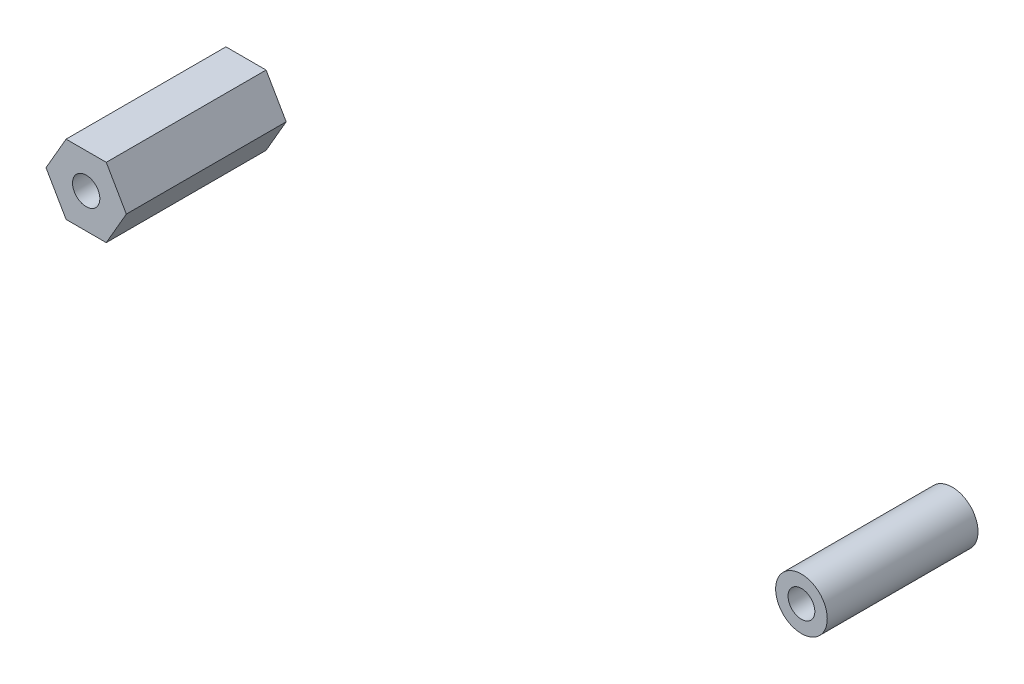
ISO-10303-21;
HEADER;
FILE_DESCRIPTION(('STEP AP214'),'2;1');
FILE_NAME('part.step','',(''),(''),'','','');
FILE_SCHEMA(('AUTOMOTIVE_DESIGN { 1 0 10303 214 1 1 1 1 }'));
ENDSEC;
DATA;
#1=APPLICATION_CONTEXT('core data for automotive mechanical design processes');
#2=APPLICATION_PROTOCOL_DEFINITION('international standard','automotive_design',2000,#1);
#3=PRODUCT_CONTEXT('',#1,'mechanical');
#4=PRODUCT('Part','Part','',(#3));
#5=PRODUCT_RELATED_PRODUCT_CATEGORY('part','',(#4));
#6=PRODUCT_DEFINITION_FORMATION('','',#4);
#7=PRODUCT_DEFINITION_CONTEXT('part definition',#1,'design');
#8=PRODUCT_DEFINITION('design','',#6,#7);
#9=PRODUCT_DEFINITION_SHAPE('','',#8);
#10=(LENGTH_UNIT() NAMED_UNIT(*) SI_UNIT(.MILLI.,.METRE.));
#11=(NAMED_UNIT(*) PLANE_ANGLE_UNIT() SI_UNIT($,.RADIAN.));
#12=(NAMED_UNIT(*) SI_UNIT($,.STERADIAN.) SOLID_ANGLE_UNIT());
#13=UNCERTAINTY_MEASURE_WITH_UNIT(LENGTH_MEASURE(1.E-05),#10,'distance_accuracy_value','');
#14=(GEOMETRIC_REPRESENTATION_CONTEXT(3) GLOBAL_UNCERTAINTY_ASSIGNED_CONTEXT((#13)) GLOBAL_UNIT_ASSIGNED_CONTEXT((#10,
#11,#12)) REPRESENTATION_CONTEXT('',''));
#15=CARTESIAN_POINT('',(0.,0.,0.));
#16=DIRECTION('',(0.,0.,1.));
#17=DIRECTION('',(1.,0.,0.));
#18=AXIS2_PLACEMENT_3D('',#15,#16,#17);
#19=CARTESIAN_POINT('',(43.18,17.78,-7.81479313427151));
#20=DIRECTION('',(0.,0.,1.));
#21=DIRECTION('',(1.,0.,0.));
#22=AXIS2_PLACEMENT_3D('',#19,#20,#21);
#23=CYLINDRICAL_SURFACE('',#22,3.1165);
#24=CARTESIAN_POINT('',(43.18,17.78,3.6));
#25=DIRECTION('',(0.,0.,1.));
#26=DIRECTION('',(1.,0.,0.));
#27=AXIS2_PLACEMENT_3D('',#24,#25,#26);
#28=CIRCLE('',#27,3.1165);
#29=CARTESIAN_POINT('',(46.2965,17.78,3.6));
#30=VERTEX_POINT('',#29);
#31=EDGE_CURVE('E49',#30,#30,#28,.F.);
#32=ORIENTED_EDGE('',*,*,#31,.F.);
#33=EDGE_LOOP('',(#32));
#34=FACE_BOUND('',#33,.T.);
#35=CARTESIAN_POINT('',(43.18,17.78,21.8));
#36=DIRECTION('',(0.,0.,1.));
#37=DIRECTION('',(1.,0.,0.));
#38=AXIS2_PLACEMENT_3D('',#35,#36,#37);
#39=CIRCLE('',#38,3.1165);
#40=CARTESIAN_POINT('',(46.2965,17.78,21.8));
#41=VERTEX_POINT('',#40);
#42=EDGE_CURVE('E53',#41,#41,#39,.T.);
#43=ORIENTED_EDGE('',*,*,#42,.F.);
#44=EDGE_LOOP('',(#43));
#45=FACE_BOUND('',#44,.T.);
#46=ADVANCED_FACE('F43',(#34,#45),#23,.T.);
#47=CARTESIAN_POINT('',(43.18,17.78,21.8));
#48=DIRECTION('',(0.,0.,1.));
#49=DIRECTION('',(1.,0.,0.));
#50=AXIS2_PLACEMENT_3D('',#47,#48,#49);
#51=PLANE('',#50);
#52=CARTESIAN_POINT('',(43.18,17.78,21.8));
#53=DIRECTION('',(0.,0.,1.));
#54=DIRECTION('',(1.,0.,0.));
#55=AXIS2_PLACEMENT_3D('',#52,#53,#54);
#56=CIRCLE('',#55,1.6165);
#57=CARTESIAN_POINT('',(44.7965,17.78,21.8));
#58=VERTEX_POINT('',#57);
#59=EDGE_CURVE('E58',#58,#58,#56,.T.);
#60=ORIENTED_EDGE('',*,*,#59,.F.);
#61=EDGE_LOOP('',(#60));
#62=FACE_BOUND('',#61,.T.);
#63=ORIENTED_EDGE('',*,*,#42,.T.);
#64=EDGE_LOOP('',(#63));
#65=FACE_BOUND('',#64,.T.);
#66=ADVANCED_FACE('F65',(#62,#65),#51,.T.);
#67=CARTESIAN_POINT('',(43.18,17.78,-7.81479313427151));
#68=DIRECTION('',(0.,0.,1.));
#69=DIRECTION('',(1.,0.,0.));
#70=AXIS2_PLACEMENT_3D('',#67,#68,#69);
#71=CYLINDRICAL_SURFACE('',#70,1.6165);
#72=CARTESIAN_POINT('',(43.18,17.78,3.6));
#73=DIRECTION('',(0.,0.,1.));
#74=DIRECTION('',(1.,0.,0.));
#75=AXIS2_PLACEMENT_3D('',#72,#73,#74);
#76=CIRCLE('',#75,1.6165);
#77=CARTESIAN_POINT('',(44.7965,17.78,3.6));
#78=VERTEX_POINT('',#77);
#79=EDGE_CURVE('E12',#78,#78,#76,.F.);
#80=ORIENTED_EDGE('',*,*,#79,.T.);
#81=EDGE_LOOP('',(#80));
#82=FACE_BOUND('',#81,.T.);
#83=ORIENTED_EDGE('',*,*,#59,.T.);
#84=EDGE_LOOP('',(#83));
#85=FACE_BOUND('',#84,.T.);
#86=ADVANCED_FACE('F63',(#82,#85),#71,.F.);
#87=CARTESIAN_POINT('',(0.,0.,3.6));
#88=DIRECTION('',(0.,0.,1.));
#89=DIRECTION('',(1.,0.,0.));
#90=AXIS2_PLACEMENT_3D('',#87,#88,#89);
#91=PLANE('',#90);
#92=ORIENTED_EDGE('',*,*,#31,.T.);
#93=EDGE_LOOP('',(#92));
#94=FACE_BOUND('',#93,.T.);
#95=ORIENTED_EDGE('',*,*,#79,.F.);
#96=EDGE_LOOP('',(#95));
#97=FACE_BOUND('',#96,.T.);
#98=ADVANCED_FACE('F84',(#94,#97),#91,.F.);
#99=CLOSED_SHELL('',(#46,#66,#86,#98));
#100=MANIFOLD_SOLID_BREP('B2',#99);
#101=CARTESIAN_POINT('',(-40.7551288694036,13.58,2.5));
#102=DIRECTION('',(-0.866025403784439,0.5,0.));
#103=DIRECTION('',(-0.5,-0.866025403784439,0.));
#104=AXIS2_PLACEMENT_3D('',#101,#102,#103);
#105=PLANE('',#104);
#106=DIRECTION('',(0.,0.,-1.));
#107=VECTOR('',#106,1.);
#108=CARTESIAN_POINT('',(-40.7551288694036,13.58,2.5));
#109=LINE('',#108,#107);
#110=CARTESIAN_POINT('',(-40.7551288694036,13.58,21.8));
#111=VERTEX_POINT('',#110);
#112=CARTESIAN_POINT('',(-40.7551288694036,13.58,2.5));
#113=VERTEX_POINT('',#112);
#114=EDGE_CURVE('E127',#111,#113,#109,.T.);
#115=ORIENTED_EDGE('',*,*,#114,.T.);
#116=DIRECTION('',(-0.5,-0.866025403784439,0.));
#117=VECTOR('',#116,1.);
#118=CARTESIAN_POINT('',(-38.3302577388072,17.78,2.5));
#119=LINE('',#118,#117);
#120=CARTESIAN_POINT('',(-38.3302577388072,17.78,2.5));
#121=VERTEX_POINT('',#120);
#122=EDGE_CURVE('E119',#121,#113,#119,.T.);
#123=ORIENTED_EDGE('',*,*,#122,.F.);
#124=DIRECTION('',(0.,0.,-1.));
#125=VECTOR('',#124,1.);
#126=CARTESIAN_POINT('',(-38.3302577388072,17.78,2.5));
#127=LINE('',#126,#125);
#128=CARTESIAN_POINT('',(-38.3302577388072,17.78,21.8));
#129=VERTEX_POINT('',#128);
#130=EDGE_CURVE('E41',#129,#121,#127,.T.);
#131=ORIENTED_EDGE('',*,*,#130,.F.);
#132=DIRECTION('',(-0.5,-0.866025403784439,0.));
#133=VECTOR('',#132,1.);
#134=CARTESIAN_POINT('',(-40.7551288694036,13.58,21.8));
#135=LINE('',#134,#133);
#136=EDGE_CURVE('E200',#129,#111,#135,.T.);
#137=ORIENTED_EDGE('',*,*,#136,.T.);
#138=EDGE_LOOP('',(#115,#123,#131,#137));
#139=FACE_BOUND('',#138,.T.);
#140=ADVANCED_FACE('F105',(#139),#105,.F.);
#141=CARTESIAN_POINT('',(-38.3302577388072,17.78,2.5));
#142=DIRECTION('',(-0.866025403784439,-0.499999999999999,0.));
#143=DIRECTION('',(0.499999999999999,-0.866025403784439,0.));
#144=AXIS2_PLACEMENT_3D('',#141,#142,#143);
#145=PLANE('',#144);
#146=ORIENTED_EDGE('',*,*,#130,.T.);
#147=DIRECTION('',(0.499999999999999,-0.866025403784439,0.));
#148=VECTOR('',#147,1.);
#149=CARTESIAN_POINT('',(-40.7551288694036,21.98,2.5));
#150=LINE('',#149,#148);
#151=CARTESIAN_POINT('',(-40.7551288694036,21.98,2.5));
#152=VERTEX_POINT('',#151);
#153=EDGE_CURVE('E170',#152,#121,#150,.T.);
#154=ORIENTED_EDGE('',*,*,#153,.F.);
#155=DIRECTION('',(0.,0.,-1.));
#156=VECTOR('',#155,1.);
#157=CARTESIAN_POINT('',(-40.7551288694036,21.98,2.5));
#158=LINE('',#157,#156);
#159=CARTESIAN_POINT('',(-40.7551288694036,21.98,21.8));
#160=VERTEX_POINT('',#159);
#161=EDGE_CURVE('E112',#160,#152,#158,.T.);
#162=ORIENTED_EDGE('',*,*,#161,.F.);
#163=DIRECTION('',(0.499999999999999,-0.866025403784439,0.));
#164=VECTOR('',#163,1.);
#165=CARTESIAN_POINT('',(-38.3302577388072,17.78,21.8));
#166=LINE('',#165,#164);
#167=EDGE_CURVE('E198',#160,#129,#166,.T.);
#168=ORIENTED_EDGE('',*,*,#167,.T.);
#169=EDGE_LOOP('',(#146,#154,#162,#168));
#170=FACE_BOUND('',#169,.T.);
#171=ADVANCED_FACE('F175',(#170),#145,.F.);
#172=CARTESIAN_POINT('',(-40.7551288694036,21.98,2.5));
#173=DIRECTION('',(0.,-1.,0.));
#174=DIRECTION('',(0.,0.,-1.));
#175=AXIS2_PLACEMENT_3D('',#172,#173,#174);
#176=PLANE('',#175);
#177=ORIENTED_EDGE('',*,*,#161,.T.);
#178=DIRECTION('',(1.,0.,0.));
#179=VECTOR('',#178,1.);
#180=CARTESIAN_POINT('',(-45.6048711305965,21.98,2.5));
#181=LINE('',#180,#179);
#182=CARTESIAN_POINT('',(-45.6048711305965,21.98,2.5));
#183=VERTEX_POINT('',#182);
#184=EDGE_CURVE('E167',#183,#152,#181,.T.);
#185=ORIENTED_EDGE('',*,*,#184,.F.);
#186=DIRECTION('',(0.,0.,-1.));
#187=VECTOR('',#186,1.);
#188=CARTESIAN_POINT('',(-45.6048711305965,21.98,2.5));
#189=LINE('',#188,#187);
#190=CARTESIAN_POINT('',(-45.6048711305965,21.98,21.8));
#191=VERTEX_POINT('',#190);
#192=EDGE_CURVE('E147',#191,#183,#189,.T.);
#193=ORIENTED_EDGE('',*,*,#192,.F.);
#194=DIRECTION('',(1.,0.,0.));
#195=VECTOR('',#194,1.);
#196=CARTESIAN_POINT('',(-40.7551288694036,21.98,21.8));
#197=LINE('',#196,#195);
#198=EDGE_CURVE('E181',#191,#160,#197,.T.);
#199=ORIENTED_EDGE('',*,*,#198,.T.);
#200=EDGE_LOOP('',(#177,#185,#193,#199));
#201=FACE_BOUND('',#200,.T.);
#202=ADVANCED_FACE('F180',(#201),#176,.F.);
#203=CARTESIAN_POINT('',(-45.6048711305965,21.98,2.5));
#204=DIRECTION('',(0.866025403784438,-0.500000000000001,0.));
#205=DIRECTION('',(0.500000000000001,0.866025403784438,0.));
#206=AXIS2_PLACEMENT_3D('',#203,#204,#205);
#207=PLANE('',#206);
#208=ORIENTED_EDGE('',*,*,#192,.T.);
#209=DIRECTION('',(0.500000000000001,0.866025403784438,0.));
#210=VECTOR('',#209,1.);
#211=CARTESIAN_POINT('',(-48.0297422611929,17.78,2.5));
#212=LINE('',#211,#210);
#213=CARTESIAN_POINT('',(-48.0297422611929,17.78,2.5));
#214=VERTEX_POINT('',#213);
#215=EDGE_CURVE('E171',#214,#183,#212,.T.);
#216=ORIENTED_EDGE('',*,*,#215,.F.);
#217=DIRECTION('',(0.,0.,-1.));
#218=VECTOR('',#217,1.);
#219=CARTESIAN_POINT('',(-48.0297422611929,17.78,2.5));
#220=LINE('',#219,#218);
#221=CARTESIAN_POINT('',(-48.0297422611929,17.78,21.8));
#222=VERTEX_POINT('',#221);
#223=EDGE_CURVE('E139',#222,#214,#220,.T.);
#224=ORIENTED_EDGE('',*,*,#223,.F.);
#225=DIRECTION('',(0.500000000000001,0.866025403784438,0.));
#226=VECTOR('',#225,1.);
#227=CARTESIAN_POINT('',(-45.6048711305965,21.98,21.8));
#228=LINE('',#227,#226);
#229=EDGE_CURVE('E195',#222,#191,#228,.T.);
#230=ORIENTED_EDGE('',*,*,#229,.T.);
#231=EDGE_LOOP('',(#208,#216,#224,#230));
#232=FACE_BOUND('',#231,.T.);
#233=ADVANCED_FACE('F214',(#232),#207,.F.);
#234=CARTESIAN_POINT('',(-48.0297422611929,17.78,2.5));
#235=DIRECTION('',(0.866025403784438,0.5,0.));
#236=DIRECTION('',(-0.5,0.866025403784438,0.));
#237=AXIS2_PLACEMENT_3D('',#234,#235,#236);
#238=PLANE('',#237);
#239=ORIENTED_EDGE('',*,*,#223,.T.);
#240=DIRECTION('',(-0.5,0.866025403784438,0.));
#241=VECTOR('',#240,1.);
#242=CARTESIAN_POINT('',(-45.6048711305965,13.58,2.5));
#243=LINE('',#242,#241);
#244=CARTESIAN_POINT('',(-45.6048711305965,13.58,2.5));
#245=VERTEX_POINT('',#244);
#246=EDGE_CURVE('E209',#245,#214,#243,.T.);
#247=ORIENTED_EDGE('',*,*,#246,.F.);
#248=DIRECTION('',(0.,0.,-1.));
#249=VECTOR('',#248,1.);
#250=CARTESIAN_POINT('',(-45.6048711305965,13.58,2.5));
#251=LINE('',#250,#249);
#252=CARTESIAN_POINT('',(-45.6048711305965,13.58,21.8));
#253=VERTEX_POINT('',#252);
#254=EDGE_CURVE('E185',#253,#245,#251,.T.);
#255=ORIENTED_EDGE('',*,*,#254,.F.);
#256=DIRECTION('',(-0.5,0.866025403784438,0.));
#257=VECTOR('',#256,1.);
#258=CARTESIAN_POINT('',(-48.0297422611929,17.78,21.8));
#259=LINE('',#258,#257);
#260=EDGE_CURVE('E192',#253,#222,#259,.T.);
#261=ORIENTED_EDGE('',*,*,#260,.T.);
#262=EDGE_LOOP('',(#239,#247,#255,#261));
#263=FACE_BOUND('',#262,.T.);
#264=ADVANCED_FACE('F215',(#263),#238,.F.);
#265=CARTESIAN_POINT('',(-45.6048711305965,13.58,2.5));
#266=DIRECTION('',(0.,1.,0.));
#267=DIRECTION('',(0.,0.,1.));
#268=AXIS2_PLACEMENT_3D('',#265,#266,#267);
#269=PLANE('',#268);
#270=ORIENTED_EDGE('',*,*,#254,.T.);
#271=DIRECTION('',(-1.,0.,0.));
#272=VECTOR('',#271,1.);
#273=CARTESIAN_POINT('',(-40.7551288694036,13.58,2.5));
#274=LINE('',#273,#272);
#275=EDGE_CURVE('E207',#113,#245,#274,.T.);
#276=ORIENTED_EDGE('',*,*,#275,.F.);
#277=ORIENTED_EDGE('',*,*,#114,.F.);
#278=DIRECTION('',(-1.,0.,0.));
#279=VECTOR('',#278,1.);
#280=CARTESIAN_POINT('',(-45.6048711305965,13.58,21.8));
#281=LINE('',#280,#279);
#282=EDGE_CURVE('E203',#111,#253,#281,.T.);
#283=ORIENTED_EDGE('',*,*,#282,.T.);
#284=EDGE_LOOP('',(#270,#276,#277,#283));
#285=FACE_BOUND('',#284,.T.);
#286=ADVANCED_FACE('F220',(#285),#269,.F.);
#287=CARTESIAN_POINT('',(0.,0.,2.5));
#288=DIRECTION('',(0.,0.,1.));
#289=DIRECTION('',(1.,0.,0.));
#290=AXIS2_PLACEMENT_3D('',#287,#288,#289);
#291=PLANE('',#290);
#292=CARTESIAN_POINT('',(-43.18,17.78,2.5));
#293=DIRECTION('',(0.,0.,1.));
#294=DIRECTION('',(1.,0.,0.));
#295=AXIS2_PLACEMENT_3D('',#292,#293,#294);
#296=CIRCLE('',#295,1.65);
#297=CARTESIAN_POINT('',(-41.53,17.78,2.5));
#298=VERTEX_POINT('',#297);
#299=EDGE_CURVE('E178',#298,#298,#296,.T.);
#300=ORIENTED_EDGE('',*,*,#299,.T.);
#301=EDGE_LOOP('',(#300));
#302=FACE_BOUND('',#301,.T.);
#303=ORIENTED_EDGE('',*,*,#153,.T.);
#304=ORIENTED_EDGE('',*,*,#122,.T.);
#305=ORIENTED_EDGE('',*,*,#275,.T.);
#306=ORIENTED_EDGE('',*,*,#246,.T.);
#307=ORIENTED_EDGE('',*,*,#215,.T.);
#308=ORIENTED_EDGE('',*,*,#184,.T.);
#309=EDGE_LOOP('',(#303,#304,#305,#306,#307,#308));
#310=FACE_BOUND('',#309,.T.);
#311=ADVANCED_FACE('F169',(#302,#310),#291,.F.);
#312=CARTESIAN_POINT('',(-43.18,17.78,34.7312119458764));
#313=DIRECTION('',(0.,0.,-1.));
#314=DIRECTION('',(-1.,0.,0.));
#315=AXIS2_PLACEMENT_3D('',#312,#313,#314);
#316=CYLINDRICAL_SURFACE('',#315,1.65);
#317=CARTESIAN_POINT('',(-43.18,17.78,21.8));
#318=DIRECTION('',(0.,0.,-1.));
#319=DIRECTION('',(-1.,0.,0.));
#320=AXIS2_PLACEMENT_3D('',#317,#318,#319);
#321=CIRCLE('',#320,1.65);
#322=CARTESIAN_POINT('',(-44.83,17.78,21.8));
#323=VERTEX_POINT('',#322);
#324=EDGE_CURVE('E189',#323,#323,#321,.T.);
#325=ORIENTED_EDGE('',*,*,#324,.F.);
#326=EDGE_LOOP('',(#325));
#327=FACE_BOUND('',#326,.T.);
#328=ORIENTED_EDGE('',*,*,#299,.F.);
#329=EDGE_LOOP('',(#328));
#330=FACE_BOUND('',#329,.T.);
#331=ADVANCED_FACE('F239',(#327,#330),#316,.F.);
#332=CARTESIAN_POINT('',(0.,0.,21.8));
#333=DIRECTION('',(0.,0.,-1.));
#334=DIRECTION('',(-1.,0.,0.));
#335=AXIS2_PLACEMENT_3D('',#332,#333,#334);
#336=PLANE('',#335);
#337=ORIENTED_EDGE('',*,*,#324,.T.);
#338=EDGE_LOOP('',(#337));
#339=FACE_BOUND('',#338,.T.);
#340=ORIENTED_EDGE('',*,*,#136,.F.);
#341=ORIENTED_EDGE('',*,*,#167,.F.);
#342=ORIENTED_EDGE('',*,*,#198,.F.);
#343=ORIENTED_EDGE('',*,*,#229,.F.);
#344=ORIENTED_EDGE('',*,*,#260,.F.);
#345=ORIENTED_EDGE('',*,*,#282,.F.);
#346=EDGE_LOOP('',(#340,#341,#342,#343,#344,#345));
#347=FACE_BOUND('',#346,.T.);
#348=ADVANCED_FACE('F219',(#339,#347),#336,.F.);
#349=CLOSED_SHELL('',(#140,#171,#202,#233,#264,#286,#311,#331,#348));
#350=MANIFOLD_SOLID_BREP('B7',#349);
#351=ADVANCED_BREP_SHAPE_REPRESENTATION('',(#18,#100,#350),#14);
#352=SHAPE_DEFINITION_REPRESENTATION(#9,#351);
ENDSEC;
END-ISO-10303-21;
